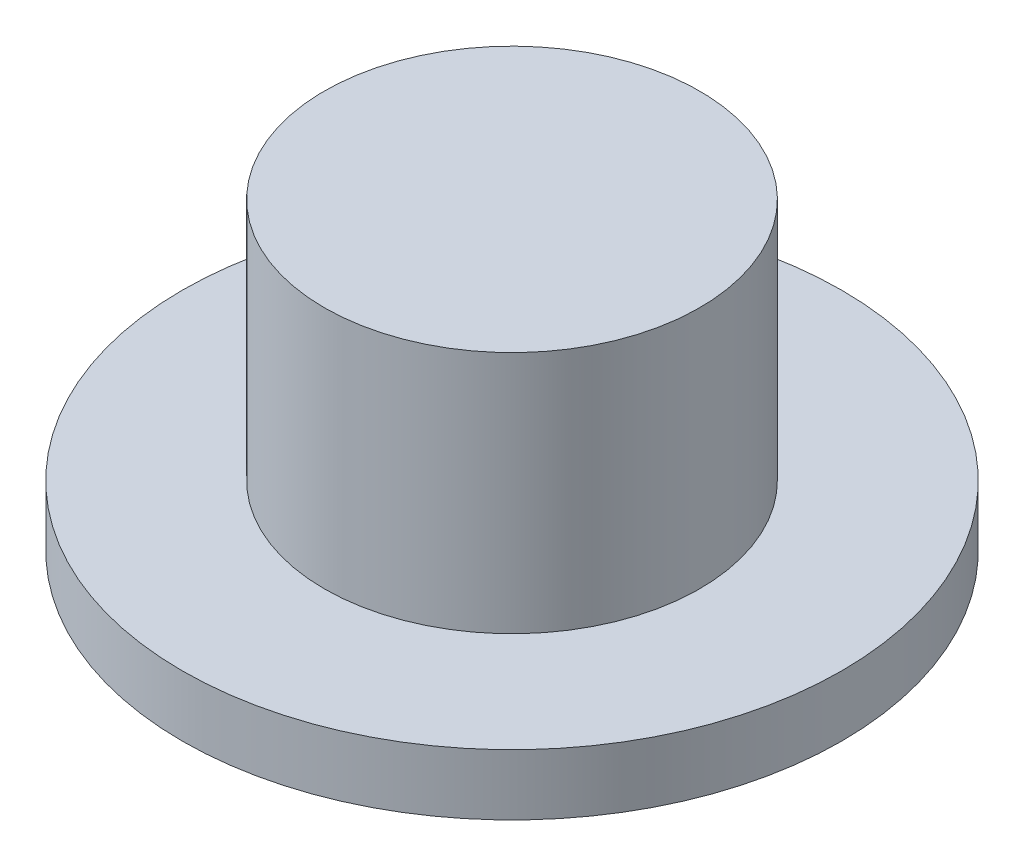
ISO-10303-21;
HEADER;
FILE_DESCRIPTION(('STEP AP214'),'2;1');
FILE_NAME('part.step','',(''),(''),'','','');
FILE_SCHEMA(('AUTOMOTIVE_DESIGN { 1 0 10303 214 1 1 1 1 }'));
ENDSEC;
DATA;
#1=APPLICATION_CONTEXT('core data for automotive mechanical design processes');
#2=APPLICATION_PROTOCOL_DEFINITION('international standard','automotive_design',2000,#1);
#3=PRODUCT_CONTEXT('',#1,'mechanical');
#4=PRODUCT('Part','Part','',(#3));
#5=PRODUCT_RELATED_PRODUCT_CATEGORY('part','',(#4));
#6=PRODUCT_DEFINITION_FORMATION('','',#4);
#7=PRODUCT_DEFINITION_CONTEXT('part definition',#1,'design');
#8=PRODUCT_DEFINITION('design','',#6,#7);
#9=PRODUCT_DEFINITION_SHAPE('','',#8);
#10=(LENGTH_UNIT() NAMED_UNIT(*) SI_UNIT(.MILLI.,.METRE.));
#11=(NAMED_UNIT(*) PLANE_ANGLE_UNIT() SI_UNIT($,.RADIAN.));
#12=(NAMED_UNIT(*) SI_UNIT($,.STERADIAN.) SOLID_ANGLE_UNIT());
#13=UNCERTAINTY_MEASURE_WITH_UNIT(LENGTH_MEASURE(1.E-05),#10,'distance_accuracy_value','');
#14=(GEOMETRIC_REPRESENTATION_CONTEXT(3) GLOBAL_UNCERTAINTY_ASSIGNED_CONTEXT((#13)) GLOBAL_UNIT_ASSIGNED_CONTEXT((#10,
#11,#12)) REPRESENTATION_CONTEXT('',''));
#15=CARTESIAN_POINT('',(0.,0.,0.));
#16=DIRECTION('',(0.,0.,1.));
#17=DIRECTION('',(1.,0.,0.));
#18=AXIS2_PLACEMENT_3D('',#15,#16,#17);
#19=CARTESIAN_POINT('',(0.,1.2,0.));
#20=DIRECTION('',(0.,-1.,0.));
#21=DIRECTION('',(0.,0.,-1.));
#22=AXIS2_PLACEMENT_3D('',#19,#20,#21);
#23=CYLINDRICAL_SURFACE('',#22,6.5);
#24=CARTESIAN_POINT('',(0.,1.2,0.));
#25=DIRECTION('',(0.,1.,0.));
#26=DIRECTION('',(0.,0.,1.));
#27=AXIS2_PLACEMENT_3D('',#24,#25,#26);
#28=CIRCLE('',#27,6.5);
#29=CARTESIAN_POINT('',(0.,1.2,6.5));
#30=VERTEX_POINT('',#29);
#31=EDGE_CURVE('E38',#30,#30,#28,.T.);
#32=ORIENTED_EDGE('',*,*,#31,.F.);
#33=EDGE_LOOP('',(#32));
#34=FACE_BOUND('',#33,.T.);
#35=CARTESIAN_POINT('',(0.,0.,0.));
#36=DIRECTION('',(0.,1.,0.));
#37=DIRECTION('',(0.,0.,1.));
#38=AXIS2_PLACEMENT_3D('',#35,#36,#37);
#39=CIRCLE('',#38,6.5);
#40=CARTESIAN_POINT('',(0.,0.,6.5));
#41=VERTEX_POINT('',#40);
#42=EDGE_CURVE('E34',#41,#41,#39,.T.);
#43=ORIENTED_EDGE('',*,*,#42,.T.);
#44=EDGE_LOOP('',(#43));
#45=FACE_BOUND('',#44,.T.);
#46=ADVANCED_FACE('F31',(#34,#45),#23,.T.);
#47=CARTESIAN_POINT('',(0.,1.2,0.));
#48=DIRECTION('',(0.,1.,0.));
#49=DIRECTION('',(0.,0.,1.));
#50=AXIS2_PLACEMENT_3D('',#47,#48,#49);
#51=PLANE('',#50);
#52=CARTESIAN_POINT('',(0.,1.2,0.));
#53=DIRECTION('',(0.,1.,0.));
#54=DIRECTION('',(0.,0.,1.));
#55=AXIS2_PLACEMENT_3D('',#52,#53,#54);
#56=CIRCLE('',#55,3.7);
#57=CARTESIAN_POINT('',(0.,1.2,3.7));
#58=VERTEX_POINT('',#57);
#59=EDGE_CURVE('E10',#58,#58,#56,.T.);
#60=ORIENTED_EDGE('',*,*,#59,.F.);
#61=EDGE_LOOP('',(#60));
#62=FACE_BOUND('',#61,.T.);
#63=ORIENTED_EDGE('',*,*,#31,.T.);
#64=EDGE_LOOP('',(#63));
#65=FACE_BOUND('',#64,.T.);
#66=ADVANCED_FACE('F55',(#62,#65),#51,.T.);
#67=CARTESIAN_POINT('',(0.,0.,0.));
#68=DIRECTION('',(0.,1.,0.));
#69=DIRECTION('',(0.,0.,1.));
#70=AXIS2_PLACEMENT_3D('',#67,#68,#69);
#71=PLANE('',#70);
#72=ORIENTED_EDGE('',*,*,#42,.F.);
#73=EDGE_LOOP('',(#72));
#74=FACE_BOUND('',#73,.T.);
#75=ADVANCED_FACE('F52',(#74),#71,.F.);
#76=CARTESIAN_POINT('',(0.,6.,0.));
#77=DIRECTION('',(0.,-1.,0.));
#78=DIRECTION('',(0.,0.,-1.));
#79=AXIS2_PLACEMENT_3D('',#76,#77,#78);
#80=CYLINDRICAL_SURFACE('',#79,3.7);
#81=CARTESIAN_POINT('',(0.,6.,0.));
#82=DIRECTION('',(0.,1.,0.));
#83=DIRECTION('',(0.,0.,1.));
#84=AXIS2_PLACEMENT_3D('',#81,#82,#83);
#85=CIRCLE('',#84,3.7);
#86=CARTESIAN_POINT('',(0.,6.,3.7));
#87=VERTEX_POINT('',#86);
#88=EDGE_CURVE('E44',#87,#87,#85,.T.);
#89=ORIENTED_EDGE('',*,*,#88,.F.);
#90=EDGE_LOOP('',(#89));
#91=FACE_BOUND('',#90,.T.);
#92=ORIENTED_EDGE('',*,*,#59,.T.);
#93=EDGE_LOOP('',(#92));
#94=FACE_BOUND('',#93,.T.);
#95=ADVANCED_FACE('F54',(#91,#94),#80,.T.);
#96=CARTESIAN_POINT('',(0.,6.,0.));
#97=DIRECTION('',(0.,1.,0.));
#98=DIRECTION('',(0.,0.,1.));
#99=AXIS2_PLACEMENT_3D('',#96,#97,#98);
#100=PLANE('',#99);
#101=ORIENTED_EDGE('',*,*,#88,.T.);
#102=EDGE_LOOP('',(#101));
#103=FACE_BOUND('',#102,.T.);
#104=ADVANCED_FACE('F60',(#103),#100,.T.);
#105=CLOSED_SHELL('',(#46,#66,#75,#95,#104));
#106=MANIFOLD_SOLID_BREP('B2',#105);
#107=ADVANCED_BREP_SHAPE_REPRESENTATION('',(#18,#106),#14);
#108=SHAPE_DEFINITION_REPRESENTATION(#9,#107);
ENDSEC;
END-ISO-10303-21;
